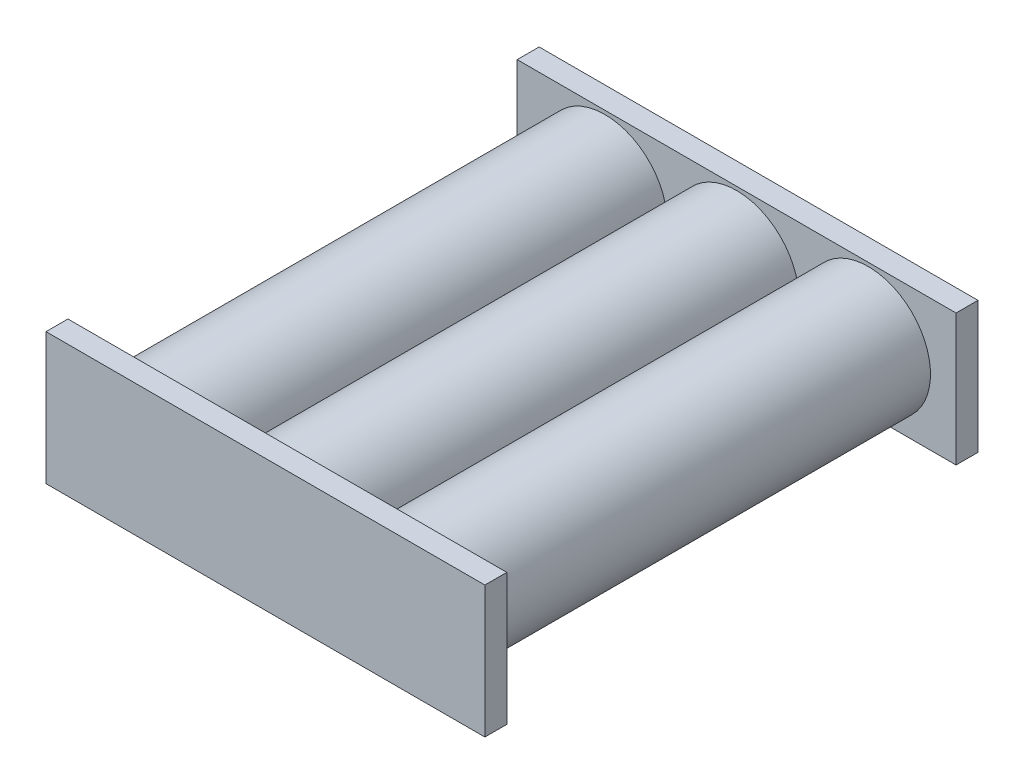
ISO-10303-21;
HEADER;
FILE_DESCRIPTION(('STEP AP214'),'2;1');
FILE_NAME('part.step','',(''),(''),'','','');
FILE_SCHEMA(('AUTOMOTIVE_DESIGN { 1 0 10303 214 1 1 1 1 }'));
ENDSEC;
DATA;
#1=APPLICATION_CONTEXT('core data for automotive mechanical design processes');
#2=APPLICATION_PROTOCOL_DEFINITION('international standard','automotive_design',2000,#1);
#3=PRODUCT_CONTEXT('',#1,'mechanical');
#4=PRODUCT('Part','Part','',(#3));
#5=PRODUCT_RELATED_PRODUCT_CATEGORY('part','',(#4));
#6=PRODUCT_DEFINITION_FORMATION('','',#4);
#7=PRODUCT_DEFINITION_CONTEXT('part definition',#1,'design');
#8=PRODUCT_DEFINITION('design','',#6,#7);
#9=PRODUCT_DEFINITION_SHAPE('','',#8);
#10=(LENGTH_UNIT() NAMED_UNIT(*) SI_UNIT(.MILLI.,.METRE.));
#11=(NAMED_UNIT(*) PLANE_ANGLE_UNIT() SI_UNIT($,.RADIAN.));
#12=(NAMED_UNIT(*) SI_UNIT($,.STERADIAN.) SOLID_ANGLE_UNIT());
#13=UNCERTAINTY_MEASURE_WITH_UNIT(LENGTH_MEASURE(1.E-05),#10,'distance_accuracy_value','');
#14=(GEOMETRIC_REPRESENTATION_CONTEXT(3) GLOBAL_UNCERTAINTY_ASSIGNED_CONTEXT((#13)) GLOBAL_UNIT_ASSIGNED_CONTEXT((#10,
#11,#12)) REPRESENTATION_CONTEXT('',''));
#15=CARTESIAN_POINT('',(0.,0.,0.));
#16=DIRECTION('',(0.,0.,1.));
#17=DIRECTION('',(1.,0.,0.));
#18=AXIS2_PLACEMENT_3D('',#15,#16,#17);
#19=CARTESIAN_POINT('',(0.,0.,65.));
#20=DIRECTION('',(0.,0.,-1.));
#21=DIRECTION('',(-1.,0.,0.));
#22=AXIS2_PLACEMENT_3D('',#19,#20,#21);
#23=CYLINDRICAL_SURFACE('',#22,9.);
#24=CARTESIAN_POINT('',(0.,0.,65.));
#25=DIRECTION('',(0.,0.,1.));
#26=DIRECTION('',(1.,0.,0.));
#27=AXIS2_PLACEMENT_3D('',#24,#25,#26);
#28=CIRCLE('',#27,9.);
#29=CARTESIAN_POINT('',(9.,0.,65.));
#30=VERTEX_POINT('',#29);
#31=EDGE_CURVE('E195',#30,#30,#28,.T.);
#32=ORIENTED_EDGE('',*,*,#31,.F.);
#33=EDGE_LOOP('',(#32));
#34=FACE_BOUND('',#33,.T.);
#35=CARTESIAN_POINT('',(0.,0.,0.));
#36=DIRECTION('',(0.,0.,1.));
#37=DIRECTION('',(1.,0.,0.));
#38=AXIS2_PLACEMENT_3D('',#35,#36,#37);
#39=CIRCLE('',#38,9.);
#40=CARTESIAN_POINT('',(9.,0.,0.));
#41=VERTEX_POINT('',#40);
#42=EDGE_CURVE('E194',#41,#41,#39,.T.);
#43=ORIENTED_EDGE('',*,*,#42,.T.);
#44=EDGE_LOOP('',(#43));
#45=FACE_BOUND('',#44,.T.);
#46=ADVANCED_FACE('F39',(#34,#45),#23,.T.);
#47=CARTESIAN_POINT('',(50.8,9.525,-3.175));
#48=DIRECTION('',(-1.,0.,0.));
#49=DIRECTION('',(0.,0.,1.));
#50=AXIS2_PLACEMENT_3D('',#47,#48,#49);
#51=PLANE('',#50);
#52=DIRECTION('',(0.,-1.,0.));
#53=VECTOR('',#52,1.);
#54=CARTESIAN_POINT('',(50.8,9.525,0.));
#55=LINE('',#54,#53);
#56=CARTESIAN_POINT('',(50.8,9.525,0.));
#57=VERTEX_POINT('',#56);
#58=CARTESIAN_POINT('',(50.8,-9.525,0.));
#59=VERTEX_POINT('',#58);
#60=EDGE_CURVE('E162',#57,#59,#55,.T.);
#61=ORIENTED_EDGE('',*,*,#60,.T.);
#62=DIRECTION('',(0.,0.,1.));
#63=VECTOR('',#62,1.);
#64=CARTESIAN_POINT('',(50.8,-9.525,-3.175));
#65=LINE('',#64,#63);
#66=CARTESIAN_POINT('',(50.8,-9.525,-3.175));
#67=VERTEX_POINT('',#66);
#68=EDGE_CURVE('E192',#67,#59,#65,.T.);
#69=ORIENTED_EDGE('',*,*,#68,.F.);
#70=DIRECTION('',(0.,-1.,0.));
#71=VECTOR('',#70,1.);
#72=CARTESIAN_POINT('',(50.8,9.525,-3.175));
#73=LINE('',#72,#71);
#74=CARTESIAN_POINT('',(50.8,9.525,-3.175));
#75=VERTEX_POINT('',#74);
#76=EDGE_CURVE('E163',#75,#67,#73,.T.);
#77=ORIENTED_EDGE('',*,*,#76,.F.);
#78=DIRECTION('',(0.,0.,1.));
#79=VECTOR('',#78,1.);
#80=CARTESIAN_POINT('',(50.8,9.525,-3.175));
#81=LINE('',#80,#79);
#82=EDGE_CURVE('E59',#75,#57,#81,.T.);
#83=ORIENTED_EDGE('',*,*,#82,.T.);
#84=EDGE_LOOP('',(#61,#69,#77,#83));
#85=FACE_BOUND('',#84,.T.);
#86=ADVANCED_FACE('F229',(#85),#51,.F.);
#87=CARTESIAN_POINT('',(50.8,-9.525,-3.175));
#88=DIRECTION('',(0.,1.,0.));
#89=DIRECTION('',(0.,0.,1.));
#90=AXIS2_PLACEMENT_3D('',#87,#88,#89);
#91=PLANE('',#90);
#92=DIRECTION('',(-1.,0.,0.));
#93=VECTOR('',#92,1.);
#94=CARTESIAN_POINT('',(50.8,-9.525,0.));
#95=LINE('',#94,#93);
#96=CARTESIAN_POINT('',(-12.7,-9.525,0.));
#97=VERTEX_POINT('',#96);
#98=EDGE_CURVE('E177',#59,#97,#95,.T.);
#99=ORIENTED_EDGE('',*,*,#98,.T.);
#100=DIRECTION('',(0.,0.,1.));
#101=VECTOR('',#100,1.);
#102=CARTESIAN_POINT('',(-12.7,-9.525,-3.175));
#103=LINE('',#102,#101);
#104=CARTESIAN_POINT('',(-12.7,-9.525,-3.175));
#105=VERTEX_POINT('',#104);
#106=EDGE_CURVE('E190',#105,#97,#103,.T.);
#107=ORIENTED_EDGE('',*,*,#106,.F.);
#108=DIRECTION('',(-1.,0.,0.));
#109=VECTOR('',#108,1.);
#110=CARTESIAN_POINT('',(50.8,-9.525,-3.175));
#111=LINE('',#110,#109);
#112=EDGE_CURVE('E89',#67,#105,#111,.T.);
#113=ORIENTED_EDGE('',*,*,#112,.F.);
#114=ORIENTED_EDGE('',*,*,#68,.T.);
#115=EDGE_LOOP('',(#99,#107,#113,#114));
#116=FACE_BOUND('',#115,.T.);
#117=ADVANCED_FACE('F225',(#116),#91,.F.);
#118=CARTESIAN_POINT('',(-12.7,9.525,-3.175));
#119=DIRECTION('',(-1.,0.,0.));
#120=DIRECTION('',(0.,0.,1.));
#121=AXIS2_PLACEMENT_3D('',#118,#119,#120);
#122=PLANE('',#121);
#123=DIRECTION('',(0.,-1.,0.));
#124=VECTOR('',#123,1.);
#125=CARTESIAN_POINT('',(-12.7,9.525,0.));
#126=LINE('',#125,#124);
#127=CARTESIAN_POINT('',(-12.7,9.525,0.));
#128=VERTEX_POINT('',#127);
#129=EDGE_CURVE('E181',#128,#97,#126,.T.);
#130=ORIENTED_EDGE('',*,*,#129,.F.);
#131=DIRECTION('',(0.,0.,1.));
#132=VECTOR('',#131,1.);
#133=CARTESIAN_POINT('',(-12.7,9.525,-3.175));
#134=LINE('',#133,#132);
#135=CARTESIAN_POINT('',(-12.7,9.525,-3.175));
#136=VERTEX_POINT('',#135);
#137=EDGE_CURVE('E75',#136,#128,#134,.T.);
#138=ORIENTED_EDGE('',*,*,#137,.F.);
#139=DIRECTION('',(0.,-1.,0.));
#140=VECTOR('',#139,1.);
#141=CARTESIAN_POINT('',(-12.7,9.525,-3.175));
#142=LINE('',#141,#140);
#143=EDGE_CURVE('E169',#136,#105,#142,.T.);
#144=ORIENTED_EDGE('',*,*,#143,.T.);
#145=ORIENTED_EDGE('',*,*,#106,.T.);
#146=EDGE_LOOP('',(#130,#138,#144,#145));
#147=FACE_BOUND('',#146,.T.);
#148=ADVANCED_FACE('F217',(#147),#122,.T.);
#149=CARTESIAN_POINT('',(50.8,9.525,-3.175));
#150=DIRECTION('',(0.,1.,0.));
#151=DIRECTION('',(0.,0.,1.));
#152=AXIS2_PLACEMENT_3D('',#149,#150,#151);
#153=PLANE('',#152);
#154=DIRECTION('',(-1.,0.,0.));
#155=VECTOR('',#154,1.);
#156=CARTESIAN_POINT('',(50.8,9.525,0.));
#157=LINE('',#156,#155);
#158=EDGE_CURVE('E166',#57,#128,#157,.T.);
#159=ORIENTED_EDGE('',*,*,#158,.F.);
#160=ORIENTED_EDGE('',*,*,#82,.F.);
#161=DIRECTION('',(-1.,0.,0.));
#162=VECTOR('',#161,1.);
#163=CARTESIAN_POINT('',(50.8,9.525,-3.175));
#164=LINE('',#163,#162);
#165=EDGE_CURVE('E172',#75,#136,#164,.T.);
#166=ORIENTED_EDGE('',*,*,#165,.T.);
#167=ORIENTED_EDGE('',*,*,#137,.T.);
#168=EDGE_LOOP('',(#159,#160,#166,#167));
#169=FACE_BOUND('',#168,.T.);
#170=ADVANCED_FACE('F215',(#169),#153,.T.);
#171=CARTESIAN_POINT('',(0.,0.,-3.175));
#172=DIRECTION('',(0.,0.,-1.));
#173=DIRECTION('',(-1.,0.,0.));
#174=AXIS2_PLACEMENT_3D('',#171,#172,#173);
#175=PLANE('',#174);
#176=ORIENTED_EDGE('',*,*,#76,.T.);
#177=ORIENTED_EDGE('',*,*,#112,.T.);
#178=ORIENTED_EDGE('',*,*,#143,.F.);
#179=ORIENTED_EDGE('',*,*,#165,.F.);
#180=EDGE_LOOP('',(#176,#177,#178,#179));
#181=FACE_BOUND('',#180,.T.);
#182=ADVANCED_FACE('F209',(#181),#175,.T.);
#183=CARTESIAN_POINT('',(0.,0.,0.));
#184=DIRECTION('',(0.,0.,-1.));
#185=DIRECTION('',(-1.,0.,0.));
#186=AXIS2_PLACEMENT_3D('',#183,#184,#185);
#187=PLANE('',#186);
#188=CARTESIAN_POINT('',(38.1,0.,0.));
#189=DIRECTION('',(0.,0.,-1.));
#190=DIRECTION('',(-1.,0.,0.));
#191=AXIS2_PLACEMENT_3D('',#188,#189,#190);
#192=CIRCLE('',#191,9.);
#193=CARTESIAN_POINT('',(29.1,0.,0.));
#194=VERTEX_POINT('',#193);
#195=EDGE_CURVE('E11',#194,#194,#192,.F.);
#196=ORIENTED_EDGE('',*,*,#195,.F.);
#197=EDGE_LOOP('',(#196));
#198=FACE_BOUND('',#197,.T.);
#199=CARTESIAN_POINT('',(19.05,0.,0.));
#200=DIRECTION('',(0.,0.,-1.));
#201=DIRECTION('',(-1.,0.,0.));
#202=AXIS2_PLACEMENT_3D('',#199,#200,#201);
#203=CIRCLE('',#202,9.);
#204=CARTESIAN_POINT('',(10.05,0.,0.));
#205=VERTEX_POINT('',#204);
#206=EDGE_CURVE('E48',#205,#205,#203,.F.);
#207=ORIENTED_EDGE('',*,*,#206,.F.);
#208=EDGE_LOOP('',(#207));
#209=FACE_BOUND('',#208,.T.);
#210=ORIENTED_EDGE('',*,*,#42,.F.);
#211=EDGE_LOOP('',(#210));
#212=FACE_BOUND('',#211,.T.);
#213=ORIENTED_EDGE('',*,*,#60,.F.);
#214=ORIENTED_EDGE('',*,*,#158,.T.);
#215=ORIENTED_EDGE('',*,*,#129,.T.);
#216=ORIENTED_EDGE('',*,*,#98,.F.);
#217=EDGE_LOOP('',(#213,#214,#215,#216));
#218=FACE_BOUND('',#217,.T.);
#219=ADVANCED_FACE('F206',(#198,#209,#212,#218),#187,.F.);
#220=CARTESIAN_POINT('',(19.05,0.,65.));
#221=DIRECTION('',(0.,0.,-1.));
#222=DIRECTION('',(-1.,0.,0.));
#223=AXIS2_PLACEMENT_3D('',#220,#221,#222);
#224=CYLINDRICAL_SURFACE('',#223,9.);
#225=CARTESIAN_POINT('',(19.05,0.,65.));
#226=DIRECTION('',(0.,0.,1.));
#227=DIRECTION('',(1.,0.,0.));
#228=AXIS2_PLACEMENT_3D('',#225,#226,#227);
#229=CIRCLE('',#228,9.);
#230=CARTESIAN_POINT('',(28.05,0.,65.));
#231=VERTEX_POINT('',#230);
#232=EDGE_CURVE('E153',#231,#231,#229,.T.);
#233=ORIENTED_EDGE('',*,*,#232,.F.);
#234=EDGE_LOOP('',(#233));
#235=FACE_BOUND('',#234,.T.);
#236=ORIENTED_EDGE('',*,*,#206,.T.);
#237=EDGE_LOOP('',(#236));
#238=FACE_BOUND('',#237,.T.);
#239=ADVANCED_FACE('F204',(#235,#238),#224,.T.);
#240=CARTESIAN_POINT('',(38.1,0.,65.));
#241=DIRECTION('',(0.,0.,-1.));
#242=DIRECTION('',(-1.,0.,0.));
#243=AXIS2_PLACEMENT_3D('',#240,#241,#242);
#244=CYLINDRICAL_SURFACE('',#243,9.);
#245=CARTESIAN_POINT('',(38.1,0.,65.));
#246=DIRECTION('',(0.,0.,1.));
#247=DIRECTION('',(1.,0.,0.));
#248=AXIS2_PLACEMENT_3D('',#245,#246,#247);
#249=CIRCLE('',#248,9.);
#250=CARTESIAN_POINT('',(47.1,0.,65.));
#251=VERTEX_POINT('',#250);
#252=EDGE_CURVE('E147',#251,#251,#249,.T.);
#253=ORIENTED_EDGE('',*,*,#252,.F.);
#254=EDGE_LOOP('',(#253));
#255=FACE_BOUND('',#254,.T.);
#256=ORIENTED_EDGE('',*,*,#195,.T.);
#257=EDGE_LOOP('',(#256));
#258=FACE_BOUND('',#257,.T.);
#259=ADVANCED_FACE('F246',(#255,#258),#244,.T.);
#260=CARTESIAN_POINT('',(50.8,9.525,65.));
#261=DIRECTION('',(-1.,0.,0.));
#262=DIRECTION('',(0.,0.,1.));
#263=AXIS2_PLACEMENT_3D('',#260,#261,#262);
#264=PLANE('',#263);
#265=DIRECTION('',(0.,-1.,0.));
#266=VECTOR('',#265,1.);
#267=CARTESIAN_POINT('',(50.8,9.525,68.175));
#268=LINE('',#267,#266);
#269=CARTESIAN_POINT('',(50.8,9.525,68.175));
#270=VERTEX_POINT('',#269);
#271=CARTESIAN_POINT('',(50.8,-9.525,68.175));
#272=VERTEX_POINT('',#271);
#273=EDGE_CURVE('E145',#270,#272,#268,.T.);
#274=ORIENTED_EDGE('',*,*,#273,.T.);
#275=DIRECTION('',(0.,0.,1.));
#276=VECTOR('',#275,1.);
#277=CARTESIAN_POINT('',(50.8,-9.525,65.));
#278=LINE('',#277,#276);
#279=CARTESIAN_POINT('',(50.8,-9.525,65.));
#280=VERTEX_POINT('',#279);
#281=EDGE_CURVE('E124',#280,#272,#278,.T.);
#282=ORIENTED_EDGE('',*,*,#281,.F.);
#283=DIRECTION('',(0.,-1.,0.));
#284=VECTOR('',#283,1.);
#285=CARTESIAN_POINT('',(50.8,9.525,65.));
#286=LINE('',#285,#284);
#287=CARTESIAN_POINT('',(50.8,9.525,65.));
#288=VERTEX_POINT('',#287);
#289=EDGE_CURVE('E132',#288,#280,#286,.T.);
#290=ORIENTED_EDGE('',*,*,#289,.F.);
#291=DIRECTION('',(0.,0.,1.));
#292=VECTOR('',#291,1.);
#293=CARTESIAN_POINT('',(50.8,9.525,65.));
#294=LINE('',#293,#292);
#295=EDGE_CURVE('E278',#288,#270,#294,.T.);
#296=ORIENTED_EDGE('',*,*,#295,.T.);
#297=EDGE_LOOP('',(#274,#282,#290,#296));
#298=FACE_BOUND('',#297,.T.);
#299=ADVANCED_FACE('F143',(#298),#264,.F.);
#300=CARTESIAN_POINT('',(50.8,-9.525,65.));
#301=DIRECTION('',(0.,1.,0.));
#302=DIRECTION('',(0.,0.,1.));
#303=AXIS2_PLACEMENT_3D('',#300,#301,#302);
#304=PLANE('',#303);
#305=DIRECTION('',(-1.,0.,0.));
#306=VECTOR('',#305,1.);
#307=CARTESIAN_POINT('',(50.8,-9.525,68.175));
#308=LINE('',#307,#306);
#309=CARTESIAN_POINT('',(-12.7,-9.525,68.175));
#310=VERTEX_POINT('',#309);
#311=EDGE_CURVE('E275',#272,#310,#308,.T.);
#312=ORIENTED_EDGE('',*,*,#311,.T.);
#313=DIRECTION('',(0.,0.,1.));
#314=VECTOR('',#313,1.);
#315=CARTESIAN_POINT('',(-12.7,-9.525,65.));
#316=LINE('',#315,#314);
#317=CARTESIAN_POINT('',(-12.7,-9.525,65.));
#318=VERTEX_POINT('',#317);
#319=EDGE_CURVE('E126',#318,#310,#316,.T.);
#320=ORIENTED_EDGE('',*,*,#319,.F.);
#321=DIRECTION('',(-1.,0.,0.));
#322=VECTOR('',#321,1.);
#323=CARTESIAN_POINT('',(50.8,-9.525,65.));
#324=LINE('',#323,#322);
#325=EDGE_CURVE('E119',#280,#318,#324,.T.);
#326=ORIENTED_EDGE('',*,*,#325,.F.);
#327=ORIENTED_EDGE('',*,*,#281,.T.);
#328=EDGE_LOOP('',(#312,#320,#326,#327));
#329=FACE_BOUND('',#328,.T.);
#330=ADVANCED_FACE('F122',(#329),#304,.F.);
#331=CARTESIAN_POINT('',(-12.7,9.525,65.));
#332=DIRECTION('',(-1.,0.,0.));
#333=DIRECTION('',(0.,0.,1.));
#334=AXIS2_PLACEMENT_3D('',#331,#332,#333);
#335=PLANE('',#334);
#336=DIRECTION('',(0.,-1.,0.));
#337=VECTOR('',#336,1.);
#338=CARTESIAN_POINT('',(-12.7,9.525,68.175));
#339=LINE('',#338,#337);
#340=CARTESIAN_POINT('',(-12.7,9.525,68.175));
#341=VERTEX_POINT('',#340);
#342=EDGE_CURVE('E281',#341,#310,#339,.T.);
#343=ORIENTED_EDGE('',*,*,#342,.F.);
#344=DIRECTION('',(0.,0.,1.));
#345=VECTOR('',#344,1.);
#346=CARTESIAN_POINT('',(-12.7,9.525,65.));
#347=LINE('',#346,#345);
#348=CARTESIAN_POINT('',(-12.7,9.525,65.));
#349=VERTEX_POINT('',#348);
#350=EDGE_CURVE('E155',#349,#341,#347,.T.);
#351=ORIENTED_EDGE('',*,*,#350,.F.);
#352=DIRECTION('',(0.,-1.,0.));
#353=VECTOR('',#352,1.);
#354=CARTESIAN_POINT('',(-12.7,9.525,65.));
#355=LINE('',#354,#353);
#356=EDGE_CURVE('E131',#349,#318,#355,.T.);
#357=ORIENTED_EDGE('',*,*,#356,.T.);
#358=ORIENTED_EDGE('',*,*,#319,.T.);
#359=EDGE_LOOP('',(#343,#351,#357,#358));
#360=FACE_BOUND('',#359,.T.);
#361=ADVANCED_FACE('F261',(#360),#335,.T.);
#362=CARTESIAN_POINT('',(50.8,9.525,65.));
#363=DIRECTION('',(0.,1.,0.));
#364=DIRECTION('',(0.,0.,1.));
#365=AXIS2_PLACEMENT_3D('',#362,#363,#364);
#366=PLANE('',#365);
#367=DIRECTION('',(-1.,0.,0.));
#368=VECTOR('',#367,1.);
#369=CARTESIAN_POINT('',(50.8,9.525,68.175));
#370=LINE('',#369,#368);
#371=EDGE_CURVE('E141',#270,#341,#370,.T.);
#372=ORIENTED_EDGE('',*,*,#371,.F.);
#373=ORIENTED_EDGE('',*,*,#295,.F.);
#374=DIRECTION('',(-1.,0.,0.));
#375=VECTOR('',#374,1.);
#376=CARTESIAN_POINT('',(50.8,9.525,65.));
#377=LINE('',#376,#375);
#378=EDGE_CURVE('E138',#288,#349,#377,.T.);
#379=ORIENTED_EDGE('',*,*,#378,.T.);
#380=ORIENTED_EDGE('',*,*,#350,.T.);
#381=EDGE_LOOP('',(#372,#373,#379,#380));
#382=FACE_BOUND('',#381,.T.);
#383=ADVANCED_FACE('F240',(#382),#366,.T.);
#384=CARTESIAN_POINT('',(0.,0.,65.));
#385=DIRECTION('',(0.,0.,-1.));
#386=DIRECTION('',(-1.,0.,0.));
#387=AXIS2_PLACEMENT_3D('',#384,#385,#386);
#388=PLANE('',#387);
#389=ORIENTED_EDGE('',*,*,#31,.T.);
#390=EDGE_LOOP('',(#389));
#391=FACE_BOUND('',#390,.T.);
#392=ORIENTED_EDGE('',*,*,#232,.T.);
#393=EDGE_LOOP('',(#392));
#394=FACE_BOUND('',#393,.T.);
#395=ORIENTED_EDGE('',*,*,#252,.T.);
#396=EDGE_LOOP('',(#395));
#397=FACE_BOUND('',#396,.T.);
#398=ORIENTED_EDGE('',*,*,#289,.T.);
#399=ORIENTED_EDGE('',*,*,#325,.T.);
#400=ORIENTED_EDGE('',*,*,#356,.F.);
#401=ORIENTED_EDGE('',*,*,#378,.F.);
#402=EDGE_LOOP('',(#398,#399,#400,#401));
#403=FACE_BOUND('',#402,.T.);
#404=ADVANCED_FACE('F136',(#391,#394,#397,#403),#388,.T.);
#405=CARTESIAN_POINT('',(0.,0.,68.175));
#406=DIRECTION('',(0.,0.,-1.));
#407=DIRECTION('',(-1.,0.,0.));
#408=AXIS2_PLACEMENT_3D('',#405,#406,#407);
#409=PLANE('',#408);
#410=ORIENTED_EDGE('',*,*,#273,.F.);
#411=ORIENTED_EDGE('',*,*,#371,.T.);
#412=ORIENTED_EDGE('',*,*,#342,.T.);
#413=ORIENTED_EDGE('',*,*,#311,.F.);
#414=EDGE_LOOP('',(#410,#411,#412,#413));
#415=FACE_BOUND('',#414,.T.);
#416=ADVANCED_FACE('F239',(#415),#409,.F.);
#417=CLOSED_SHELL('',(#46,#86,#117,#148,#170,#182,#219,#239,#259,#299,#330,#361,#383,#404,#416));
#418=MANIFOLD_SOLID_BREP('B2',#417);
#419=ADVANCED_BREP_SHAPE_REPRESENTATION('',(#18,#418),#14);
#420=SHAPE_DEFINITION_REPRESENTATION(#9,#419);
ENDSEC;
END-ISO-10303-21;
